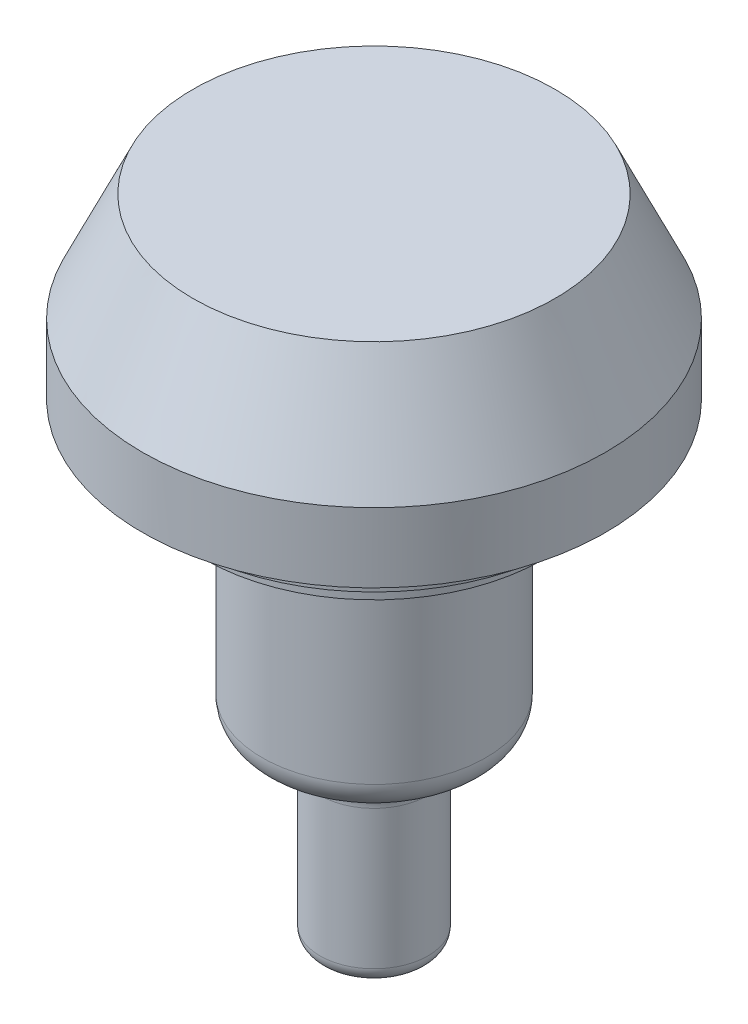
ISO-10303-21;
HEADER;
FILE_DESCRIPTION(('STEP AP214'),'2;1');
FILE_NAME('part.step','',(''),(''),'','','');
FILE_SCHEMA(('AUTOMOTIVE_DESIGN { 1 0 10303 214 1 1 1 1 }'));
ENDSEC;
DATA;
#1=APPLICATION_CONTEXT('core data for automotive mechanical design processes');
#2=APPLICATION_PROTOCOL_DEFINITION('international standard','automotive_design',2000,#1);
#3=PRODUCT_CONTEXT('',#1,'mechanical');
#4=PRODUCT('Part','Part','',(#3));
#5=PRODUCT_RELATED_PRODUCT_CATEGORY('part','',(#4));
#6=PRODUCT_DEFINITION_FORMATION('','',#4);
#7=PRODUCT_DEFINITION_CONTEXT('part definition',#1,'design');
#8=PRODUCT_DEFINITION('design','',#6,#7);
#9=PRODUCT_DEFINITION_SHAPE('','',#8);
#10=(LENGTH_UNIT() NAMED_UNIT(*) SI_UNIT(.MILLI.,.METRE.));
#11=(NAMED_UNIT(*) PLANE_ANGLE_UNIT() SI_UNIT($,.RADIAN.));
#12=(NAMED_UNIT(*) SI_UNIT($,.STERADIAN.) SOLID_ANGLE_UNIT());
#13=UNCERTAINTY_MEASURE_WITH_UNIT(LENGTH_MEASURE(1.E-05),#10,'distance_accuracy_value','');
#14=(GEOMETRIC_REPRESENTATION_CONTEXT(3) GLOBAL_UNCERTAINTY_ASSIGNED_CONTEXT((#13)) GLOBAL_UNIT_ASSIGNED_CONTEXT((#10,
#11,#12)) REPRESENTATION_CONTEXT('',''));
#15=CARTESIAN_POINT('',(0.,0.,0.));
#16=DIRECTION('',(0.,0.,1.));
#17=DIRECTION('',(1.,0.,0.));
#18=AXIS2_PLACEMENT_3D('',#15,#16,#17);
#19=CARTESIAN_POINT('',(0.,1.95,0.));
#20=DIRECTION('',(0.,1.,0.));
#21=DIRECTION('',(-0.658720422191548,0.,0.752387802524595));
#22=AXIS2_PLACEMENT_3D('',#19,#20,#21);
#23=PLANE('',#22);
#24=CARTESIAN_POINT('',(-0.0448046285500582,1.95,-0.0399100181147569));
#25=DIRECTION('',(0.,-1.,0.));
#26=DIRECTION('',(0.658720422191548,0.,-0.752387802524595));
#27=AXIS2_PLACEMENT_3D('',#24,#25,#26);
#28=CIRCLE('',#27,1.10610572348777);
#29=CARTESIAN_POINT('',(-0.668196198394019,1.95,0.873792790340968));
#30=VERTEX_POINT('',#29);
#31=CARTESIAN_POINT('',(0.791021649955044,1.94999999999869,-0.764385210023286));
#32=VERTEX_POINT('',#31);
#33=EDGE_CURVE('E58',#30,#32,#28,.T.);
#34=ORIENTED_EDGE('',*,*,#33,.F.);
#35=CARTESIAN_POINT('',(0.,1.95,0.));
#36=DIRECTION('',(0.,1.,0.));
#37=DIRECTION('',(-0.658720422191548,0.,0.752387802524595));
#38=AXIS2_PLACEMENT_3D('',#35,#36,#37);
#39=CIRCLE('',#38,1.1);
#40=EDGE_CURVE('E83',#32,#30,#39,.F.);
#41=ORIENTED_EDGE('',*,*,#40,.F.);
#42=EDGE_LOOP('',(#34,#41));
#43=FACE_BOUND('',#42,.T.);
#44=CARTESIAN_POINT('',(0.,1.95,0.));
#45=DIRECTION('',(0.,-1.,0.));
#46=DIRECTION('',(0.,0.,-1.));
#47=AXIS2_PLACEMENT_3D('',#44,#45,#46);
#48=CIRCLE('',#47,1.25);
#49=CARTESIAN_POINT('',(0.,1.95,-1.25));
#50=VERTEX_POINT('',#49);
#51=EDGE_CURVE('E206',#50,#50,#48,.T.);
#52=ORIENTED_EDGE('',*,*,#51,.T.);
#53=EDGE_LOOP('',(#52));
#54=FACE_BOUND('',#53,.T.);
#55=ADVANCED_FACE('F43',(#43,#54),#23,.F.);
#56=CARTESIAN_POINT('',(0.,0.299999999999998,0.));
#57=DIRECTION('',(0.,1.,0.));
#58=DIRECTION('',(-0.658720422191548,0.,0.752387802524595));
#59=AXIS2_PLACEMENT_3D('',#56,#57,#58);
#60=CYLINDRICAL_SURFACE('',#59,1.1);
#61=ORIENTED_EDGE('',*,*,#40,.T.);
#62=CARTESIAN_POINT('',(-0.915486598019785,1.74346292412624,-0.609823161946244));
#63=CARTESIAN_POINT('',(-0.943945164891574,1.75116457478404,-0.567140167663536));
#64=CARTESIAN_POINT('',(-0.969375914665018,1.75882984965591,-0.522451288770474));
#65=CARTESIAN_POINT('',(-1.0138521111218,1.77406122869552,-0.42981261501476));
#66=CARTESIAN_POINT('',(-1.0328777795935,1.78162695760265,-0.381853259713522));
#67=CARTESIAN_POINT('',(-1.06736490140067,1.79818369857554,-0.273206339421187));
#68=CARTESIAN_POINT('',(-1.08119528380563,1.80713370081647,-0.211989307676555));
#69=CARTESIAN_POINT('',(-1.09823022979092,1.82466013635233,-0.0881848131171558));
#70=CARTESIAN_POINT('',(-1.10146475447942,1.83323755519239,-0.025601719034775));
#71=CARTESIAN_POINT('',(-1.09861928965978,1.84466720209777,0.0597446990209417));
#72=CARTESIAN_POINT('',(-1.09712935423166,1.84771638620718,0.0827127282375821));
#73=CARTESIAN_POINT('',(-1.08894684501291,1.85888336692239,0.167457128924949));
#74=CARTESIAN_POINT('',(-1.07771594553618,1.866815003287,0.228899326109345));
#75=CARTESIAN_POINT('',(-1.04498242643328,1.8821701814969,0.349159217324231));
#76=CARTESIAN_POINT('',(-1.02345579965003,1.88959248921902,0.407970424229154));
#77=CARTESIAN_POINT('',(-0.970765350805557,1.90385186330161,0.521051658536534));
#78=CARTESIAN_POINT('',(-0.939620653446552,1.91069005697806,0.575330428591939));
#79=CARTESIAN_POINT('',(-0.86854585856241,1.92375901222159,0.677878997181826));
#80=CARTESIAN_POINT('',(-0.828615708362194,1.92998977014633,0.726148759685288));
#81=CARTESIAN_POINT('',(-0.741265408447276,1.94179925656376,0.815108293070741));
#82=CARTESIAN_POINT('',(-0.693870840635844,1.94738010275694,0.855822954772671));
#83=CARTESIAN_POINT('',(-0.592908798442302,1.95789310112659,0.928609229198853));
#84=CARTESIAN_POINT('',(-0.539356433937672,1.96282678015174,0.960701379639754));
#85=CARTESIAN_POINT('',(-0.465006269529861,1.96896462451942,0.99709483111598));
#86=CARTESIAN_POINT('',(-0.446220380440334,1.97045890290197,1.00564183887785));
#87=CARTESIAN_POINT('',(-0.389877888575809,1.97478272097837,1.02938396759045));
#88=CARTESIAN_POINT('',(-0.351653993587545,1.9775134816208,1.04306206401));
#89=CARTESIAN_POINT('',(-0.273875276211961,1.98270840327475,1.06613521191555));
#90=CARTESIAN_POINT('',(-0.234318478486845,1.98517214353565,1.07552357671605));
#91=CARTESIAN_POINT('',(-0.133438181589357,1.99105352395393,1.09362377689738));
#92=CARTESIAN_POINT('',(-0.0715521301081961,1.99429602508997,1.09941299384485));
#93=CARTESIAN_POINT('',(0.0523720008038257,2.00017197101951,1.10050340020751));
#94=CARTESIAN_POINT('',(0.114410170581359,2.00280479897993,1.0957940184658));
#95=CARTESIAN_POINT('',(0.236696069375031,2.00746667293534,1.07600810831917));
#96=CARTESIAN_POINT('',(0.296948284382647,2.00949737221633,1.06096035088571));
#97=CARTESIAN_POINT('',(0.384745960491084,2.01210461575112,1.03098590758095));
#98=CARTESIAN_POINT('',(0.413594760510347,2.01290083495343,1.01975356822588));
#99=CARTESIAN_POINT('',(0.470248375990826,2.01434881485357,0.994898091486304));
#100=CARTESIAN_POINT('',(0.498053154644858,2.01500057046227,0.981274869906644));
#101=CARTESIAN_POINT('',(0.525248448528422,2.0155812470126,0.966495766839479));
#102=B_SPLINE_CURVE_WITH_KNOTS('',3,(#62,#63,#64,#65,#66,#67,#68,#69,#70,#71,#72,#73,#74,#75,
#76,#77,#78,#79,#80,#81,#82,#83,#84,#85,#86,#87,#88,#89,#90,#91,#92,#93,#94,#95,#96,#97,#98,#99,
#100,#101),.UNSPECIFIED.,.F.,.F.,(4,2,2,2,2,2,2,2,2,2,2,2,2,2,2,2,2,2,2,4),(0.,
0.155474439203372,0.311424655405811,0.500708630247019,0.689456916956165,0.759088541513781,
0.946971053847692,1.13529381481297,1.32324449742105,1.51119630695875,1.69851745337782,
1.88538838784893,1.94745069107202,2.06923423604701,2.19120697077319,2.37698078195417,
2.56294173535168,2.7483872576961,2.84119773590927,2.93401148310828),.UNSPECIFIED.);
#103=CARTESIAN_POINT('',(-1.09476930649319,1.85093592920389,0.107145534486444));
#104=VERTEX_POINT('',#103);
#105=EDGE_CURVE('E86',#104,#30,#102,.T.);
#106=ORIENTED_EDGE('',*,*,#105,.F.);
#107=CARTESIAN_POINT('',(-0.00855734479166328,1.85326038980945,-1.09996671397364));
#108=CARTESIAN_POINT('',(-0.00993979508496553,1.85273730387153,-1.09995606833286));
#109=CARTESIAN_POINT('',(-0.0113540452003549,1.85234562789422,-1.0999423730486));
#110=CARTESIAN_POINT('',(-0.0145624367885215,1.85164557724258,-1.09990498815906));
#111=CARTESIAN_POINT('',(-0.0163663148780678,1.85137973408686,-1.09987968903415));
#112=CARTESIAN_POINT('',(-0.0251939447708239,1.85018779879858,-1.09973400287207));
#113=CARTESIAN_POINT('',(-0.032242737729209,1.84957296347319,-1.09955005586147));
#114=CARTESIAN_POINT('',(-0.0534056498261139,1.84800012250523,-1.09879341028478));
#115=CARTESIAN_POINT('',(-0.0675344333635465,1.847314017439,-1.09801590164543));
#116=CARTESIAN_POINT('',(-0.0957679306521109,1.84618485521401,-1.09591489461658));
#117=CARTESIAN_POINT('',(-0.109872609754976,1.84574202489366,-1.09459088866003));
#118=CARTESIAN_POINT('',(-0.152484322192185,1.84463287365812,-1.08975787985439));
#119=CARTESIAN_POINT('',(-0.180908209137961,1.84420398792293,-1.08540127014751));
#120=CARTESIAN_POINT('',(-0.237334749715462,1.84366371633864,-1.07447669619985));
#121=CARTESIAN_POINT('',(-0.265337155868344,1.84355251030033,-1.06790748194694));
#122=CARTESIAN_POINT('',(-0.348530233403254,1.84354897243334,-1.04490812244565));
#123=CARTESIAN_POINT('',(-0.402854448401092,1.84398752094971,-1.02519222175516));
#124=CARTESIAN_POINT('',(-0.507689406712555,1.84531102629111,-0.977533391764518));
#125=CARTESIAN_POINT('',(-0.558201862268665,1.84619578129132,-0.949594184346997));
#126=CARTESIAN_POINT('',(-0.654176746409287,1.8481596491768,-0.886199414300844));
#127=CARTESIAN_POINT('',(-0.699647647423077,1.84923842774673,-0.850756762282249));
#128=CARTESIAN_POINT('',(-0.764556060909855,1.8504608660493,-0.791445699205076));
#129=CARTESIAN_POINT('',(-0.786199335966216,1.85080579771861,-0.769947671638242));
#130=CARTESIAN_POINT('',(-0.827630329540598,1.85100401360584,-0.72522917768518));
#131=CARTESIAN_POINT('',(-0.847417955360651,1.85085727327597,-0.702008625354812));
#132=CARTESIAN_POINT('',(-0.904231192984285,1.8499729050725,-0.629415916513786));
#133=CARTESIAN_POINT('',(-0.938186324321254,1.84878440957154,-0.577588541414445));
#134=CARTESIAN_POINT('',(-0.996982921935284,1.84660423170925,-0.468891291353984));
#135=CARTESIAN_POINT('',(-1.0218039187706,1.84561299365221,-0.412010441236026));
#136=CARTESIAN_POINT('',(-1.0615771830029,1.84409744918066,-0.294759088914627));
#137=CARTESIAN_POINT('',(-1.07651616810467,1.84357377087859,-0.23438400813478));
#138=CARTESIAN_POINT('',(-1.09113961257739,1.84354149508796,-0.142737095153309));
#139=CARTESIAN_POINT('',(-1.09471685318566,1.84365584721402,-0.112034816521109));
#140=CARTESIAN_POINT('',(-1.09927496947723,1.84425290799365,-0.0504456015723031));
#141=CARTESIAN_POINT('',(-1.10025768146964,1.84473535581114,-0.0195588113723566));
#142=CARTESIAN_POINT('',(-1.09972962709913,1.84618950673447,0.0320532191002703));
#143=CARTESIAN_POINT('',(-1.09892887881413,1.84694975261948,0.0528000505056662));
#144=CARTESIAN_POINT('',(-1.0969872568779,1.84858933481597,0.0817732800400518));
#145=CARTESIAN_POINT('',(-1.09634009046476,1.8491224479868,0.0900301026022301));
#146=CARTESIAN_POINT('',(-1.09523771973328,1.85035797946265,0.10233120117168));
#147=CARTESIAN_POINT('',(-1.09484829964873,1.85084250752662,0.106417778666949));
#148=CARTESIAN_POINT('',(-1.0942349221656,1.85169370325126,0.112488167966511));
#149=CARTESIAN_POINT('',(-1.09403028530595,1.85199054210852,0.114459852039297));
#150=CARTESIAN_POINT('',(-1.09374510935851,1.85285419454195,0.11714262904443));
#151=CARTESIAN_POINT('',(-1.09366034181904,1.85317056392993,0.117931471060739));
#152=CARTESIAN_POINT('',(-1.09357740288601,1.85356641745139,0.118694835174588));
#153=B_SPLINE_CURVE_WITH_KNOTS('',3,(#107,#108,#109,#110,#111,#112,#113,#114,#115,#116,#117,
#118,#119,#120,#121,#122,#123,#124,#125,#126,#127,#128,#129,#130,#131,#132,#133,#134,#135,#136,
#137,#138,#139,#140,#141,#142,#143,#144,#145,#146,#147,#148,#149,#150,#151,#152),.UNSPECIFIED.,
.F.,.F.,(4,2,2,2,2,2,2,2,2,2,2,2,2,2,2,2,2,2,2,2,2,2,4),(0.,0.0044037435222713,
0.00986403922279407,0.0310985293297633,0.0735731511065102,0.116087310868016,0.20225694607549,
0.288475344748968,0.461068393494168,0.633583446139653,0.805804043216727,0.897231717061119,
0.988663955695987,1.17361806302945,1.35898416114147,1.54459890410945,1.63724387105953,
1.72982324981094,1.79214262318768,1.81700514393278,1.82943784209397,1.83540232340249,
1.83796591659925),.UNSPECIFIED.);
#154=CARTESIAN_POINT('',(-1.08111693483492,1.84360323981823,-0.20294376859939));
#155=VERTEX_POINT('',#154);
#156=EDGE_CURVE('E139',#104,#155,#153,.F.);
#157=ORIENTED_EDGE('',*,*,#156,.T.);
#158=CARTESIAN_POINT('',(-1.09946423159981,1.83519987667276,0.034327881271435));
#159=CARTESIAN_POINT('',(-1.09946535213747,1.83525167349134,0.0342920006333994));
#160=CARTESIAN_POINT('',(-1.09946665964423,1.83529785662923,0.0342500594010405));
#161=CARTESIAN_POINT('',(-1.09946948311624,1.83538149642558,0.034159297171583));
#162=CARTESIAN_POINT('',(-1.0994709953555,1.83541908250055,0.0341105988250543));
#163=CARTESIAN_POINT('',(-1.09947720947697,1.83555965537534,0.0339100031889066));
#164=CARTESIAN_POINT('',(-1.09948226343554,1.8356437458204,0.0337458047611557));
#165=CARTESIAN_POINT('',(-1.09949261807048,1.83579513673816,0.0334067869253979));
#166=CARTESIAN_POINT('',(-1.09949792171633,1.83586203649006,0.0332318149163343));
#167=CARTESIAN_POINT('',(-1.09954469961122,1.83641897231248,0.0316755699598856));
#168=CARTESIAN_POINT('',(-1.09958568975936,1.83667660541692,0.0302214317486111));
#169=CARTESIAN_POINT('',(-1.09977554219023,1.83783276058341,0.0229723202596975));
#170=CARTESIAN_POINT('',(-1.09988161540259,1.83835167877652,0.0171625698245873));
#171=CARTESIAN_POINT('',(-1.10006120136848,1.83967949699788,-0.000285181617655561));
#172=CARTESIAN_POINT('',(-1.09999666623088,1.84026124976626,-0.0119555269271108));
#173=CARTESIAN_POINT('',(-1.0994958016181,1.84121538702103,-0.0352978895549427));
#174=CARTESIAN_POINT('',(-1.09905900399453,1.84158750689894,-0.0469698904678813));
#175=CARTESIAN_POINT('',(-1.09718067590617,1.84252630344721,-0.0821471251034872));
#176=CARTESIAN_POINT('',(-1.0951692902054,1.84290684415608,-0.105633144110443));
#177=CARTESIAN_POINT('',(-1.08964242049431,1.84341921854424,-0.152432331286369));
#178=CARTESIAN_POINT('',(-1.08612628161255,1.84355094380329,-0.17574541969637));
#179=CARTESIAN_POINT('',(-1.07331893894628,1.8436875084682,-0.245389064254365));
#180=CARTESIAN_POINT('',(-1.0617741494315,1.84343209564235,-0.291324469426868));
#181=CARTESIAN_POINT('',(-1.02840523081856,1.84242406338926,-0.395234572996236));
#182=CARTESIAN_POINT('',(-1.00450787616008,1.84154227855882,-0.452547515256974));
#183=CARTESIAN_POINT('',(-0.947466605835286,1.83934425416549,-0.562240966777854));
#184=CARTESIAN_POINT('',(-0.914342892819457,1.83802896269735,-0.614631922100573));
#185=CARTESIAN_POINT('',(-0.865006040474519,1.83649026829555,-0.679831461935059));
#186=CARTESIAN_POINT('',(-0.852458731430448,1.83612883698407,-0.695500423136863));
#187=CARTESIAN_POINT('',(-0.833544079081294,1.83546249635864,-0.717834985301457));
#188=CARTESIAN_POINT('',(-0.827507910486508,1.83523289118395,-0.724783056365537));
#189=CARTESIAN_POINT('',(-0.821384912694009,1.83497243609263,-0.731654023383165));
#190=B_SPLINE_CURVE_WITH_KNOTS('',3,(#158,#159,#160,#161,#162,#163,#164,#165,#166,#167,#168,
#169,#170,#171,#172,#173,#174,#175,#176,#177,#178,#179,#180,#181,#182,#183,#184,#185,#186,#187,
#188,#189),.UNSPECIFIED.,.F.,.F.,(4,2,2,2,2,2,2,2,2,2,2,2,2,2,2,4),(0.,0.000186882671486975,
0.000370733504283599,0.00092088199138399,0.00148288200293672,0.005885201384305,
0.023414144423681,0.0584300260380131,0.0934900078752685,0.164151113994454,0.234843003283637,
0.376523576381709,0.561948231639137,0.74697001798191,0.807178817657127,0.834796941961388),.UNSPECIFIED.);
#191=CARTESIAN_POINT('',(-0.832501993411637,1.83539987667722,-0.718977659362765));
#192=VERTEX_POINT('',#191);
#193=EDGE_CURVE('E92',#155,#192,#190,.T.);
#194=ORIENTED_EDGE('',*,*,#193,.T.);
#195=CARTESIAN_POINT('',(-0.0448046285500582,1.83539987667722,-0.0399100181147569));
#196=DIRECTION('',(0.,-1.,0.));
#197=DIRECTION('',(0.658720422191548,0.,-0.752387802524595));
#198=AXIS2_PLACEMENT_3D('',#195,#196,#197);
#199=CIRCLE('',#198,1.04);
#200=CARTESIAN_POINT('',(-0.810068306501531,1.83539987667722,-0.744162460927834));
#201=VERTEX_POINT('',#200);
#202=EDGE_CURVE('E66',#192,#201,#199,.T.);
#203=ORIENTED_EDGE('',*,*,#202,.T.);
#204=CARTESIAN_POINT('',(-0.0924672873792373,1.83507970086425,-1.09610665574322));
#205=CARTESIAN_POINT('',(-0.0924741215590893,1.83510131298383,-1.09610607920941));
#206=CARTESIAN_POINT('',(-0.0924828089664599,1.83512220475948,-1.09610534628014));
#207=CARTESIAN_POINT('',(-0.0925029179697273,1.83516224192602,-1.09610364942036));
#208=CARTESIAN_POINT('',(-0.0925142962231102,1.83518140895185,-1.09610268915146));
#209=CARTESIAN_POINT('',(-0.0925607643868696,1.83525068585013,-1.0960987665447));
#210=CARTESIAN_POINT('',(-0.0926024837747965,1.83529620178722,-1.09609524309822));
#211=CARTESIAN_POINT('',(-0.09269329438018,1.83538016335595,-1.09608756739072));
#212=CARTESIAN_POINT('',(-0.0927425126943106,1.83541845502383,-1.09608340427519));
#213=CARTESIAN_POINT('',(-0.0929446895004997,1.83556087106399,-1.09606628778446));
#214=CARTESIAN_POINT('',(-0.0931106530971017,1.83564574822135,-1.09605220392037));
#215=CARTESIAN_POINT('',(-0.0934490100209512,1.83579667744507,-1.09602340885031));
#216=CARTESIAN_POINT('',(-0.093621391450152,1.83586276255926,-1.0960086987986));
#217=CARTESIAN_POINT('',(-0.0951702375666012,1.83641892994009,-1.09587613891706));
#218=CARTESIAN_POINT('',(-0.0966196406000967,1.83667658792911,-1.09574936355939));
#219=CARTESIAN_POINT('',(-0.103843155566011,1.83783283042649,-1.09510300164826));
#220=CARTESIAN_POINT('',(-0.109626060149873,1.83835170182011,-1.09453928950053));
#221=CARTESIAN_POINT('',(-0.126981186031906,1.83967971468026,-1.0927079008057));
#222=CARTESIAN_POINT('',(-0.138570206720884,1.84026159967235,-1.09129921099709));
#223=CARTESIAN_POINT('',(-0.161699770729566,1.84121561197193,-1.08811308166198));
#224=CARTESIAN_POINT('',(-0.173240276772771,1.84158759981639,-1.0863353980333));
#225=CARTESIAN_POINT('',(-0.207972936558945,1.84252655681677,-1.08041717477604));
#226=CARTESIAN_POINT('',(-0.231080376651477,1.84290716355818,-1.0757120606697));
#227=CARTESIAN_POINT('',(-0.276949993566797,1.84341952854652,-1.06482645656154));
#228=CARTESIAN_POINT('',(-0.299712014593257,1.8435511776307,-1.05864532069228));
#229=CARTESIAN_POINT('',(-0.367407014744984,1.84368729108688,-1.03790154406733));
#230=CARTESIAN_POINT('',(-0.411688683561709,1.8434319159251,-1.02114881930225));
#231=CARTESIAN_POINT('',(-0.511041822894386,1.84242411751573,-0.976044704568256));
#232=CARTESIAN_POINT('',(-0.565216538895774,1.84154243373755,-0.945708688248984));
#233=CARTESIAN_POINT('',(-0.667611609208022,1.83934447042717,-0.876415016163894));
#234=CARTESIAN_POINT('',(-0.715843639950439,1.83802906242258,-0.837474701261497));
#235=CARTESIAN_POINT('',(-0.774931081249809,1.83649026873366,-0.780953319091207));
#236=CARTESIAN_POINT('',(-0.789050688683879,1.83612883705934,-0.76668490144894));
#237=CARTESIAN_POINT('',(-0.809058210881307,1.83546249626623,-0.745323828390406));
#238=CARTESIAN_POINT('',(-0.81526485722192,1.83523289104854,-0.738527611597971));
#239=CARTESIAN_POINT('',(-0.821384912694009,1.83497243609263,-0.731654023383172));
#240=B_SPLINE_CURVE_WITH_KNOTS('',3,(#204,#205,#206,#207,#208,#209,#210,#211,#212,#213,#214,
#215,#216,#217,#218,#219,#220,#221,#222,#223,#224,#225,#226,#227,#228,#229,#230,#231,#232,#233,
#234,#235,#236,#237,#238,#239),.UNSPECIFIED.,.F.,.F.,(4,2,2,2,2,2,2,2,2,2,2,2,2,2,2,2,2,4),(0.,
6.77562135846907E-05,0.000134487602406872,0.000318081770058338,0.000505230795423202,
0.001061791711697,0.00161736771533274,0.00601968728613713,0.023548631082849,0.0585749412675526,
0.0936244968408819,0.164314174931119,0.235034841787796,0.376658167509954,0.562066544951151,
0.747104609499654,0.807313392541829,0.834931516846083),.UNSPECIFIED.);
#241=CARTESIAN_POINT('',(-0.326106386345146,1.84360323981823,-1.05054967744736));
#242=VERTEX_POINT('',#241);
#243=EDGE_CURVE('E140',#201,#242,#240,.F.);
#244=ORIENTED_EDGE('',*,*,#243,.T.);
#245=CARTESIAN_POINT('',(-0.0196528622328461,1.85093592920389,-1.09982442462606));
#246=VERTEX_POINT('',#245);
#247=EDGE_CURVE('E102',#242,#246,#153,.F.);
#248=ORIENTED_EDGE('',*,*,#247,.T.);
#249=CARTESIAN_POINT('',(0.887517914541648,2.018861271022,0.649855331106681));
#250=CARTESIAN_POINT('',(0.905782645657606,2.01870128478545,0.624910561397183));
#251=CARTESIAN_POINT('',(0.922986404361818,2.01847123073252,0.599207762234235));
#252=CARTESIAN_POINT('',(0.955169822121519,2.01786978233226,0.546448900480671));
#253=CARTESIAN_POINT('',(0.970149591995517,2.01749839503068,0.519392905407945));
#254=CARTESIAN_POINT('',(1.01154822747358,2.0161721238376,0.436543615693591));
#255=CARTESIAN_POINT('',(1.03449864122427,2.01500451324954,0.378970165425753));
#256=CARTESIAN_POINT('',(1.07042712528455,2.01209342763903,0.2607856703988));
#257=CARTESIAN_POINT('',(1.08339687474159,2.01034947384834,0.20017213587093));
#258=CARTESIAN_POINT('',(1.09899460497374,2.00627326286763,0.0776181223949942));
#259=CARTESIAN_POINT('',(1.10161923950121,2.00394081558207,0.0156772206073407));
#260=CARTESIAN_POINT('',(1.09645166627158,1.99867374294069,-0.107787494079663));
#261=CARTESIAN_POINT('',(1.08864997320322,1.99573857131564,-0.169310875941093));
#262=CARTESIAN_POINT('',(1.06285310553332,1.98925755784434,-0.290074076814318));
#263=CARTESIAN_POINT('',(1.04487589046075,1.98571279955586,-0.349317723277346));
#264=CARTESIAN_POINT('',(1.01291084935795,1.98030576636892,-0.429690429582741));
#265=CARTESIAN_POINT('',(1.00292921057439,1.9786996046343,-0.452495091216148));
#266=CARTESIAN_POINT('',(0.981448833143792,1.97538577973139,-0.497370046374264));
#267=CARTESIAN_POINT('',(0.969950131107756,1.9736781190131,-0.519440357604825));
#268=CARTESIAN_POINT('',(0.927284335949208,1.96754441401712,-0.594947583839971));
#269=CARTESIAN_POINT('',(0.892279526137913,1.9628493966382,-0.646264124112937));
#270=CARTESIAN_POINT('',(0.814138278669284,1.9528211064236,-0.742310075813996));
#271=CARTESIAN_POINT('',(0.770987222273598,1.94748669254946,-0.787027383584226));
#272=CARTESIAN_POINT('',(0.677844596680784,1.93619414740144,-0.868534866103928));
#273=CARTESIAN_POINT('',(0.627855618227355,1.93023625255121,-0.905328029615976));
#274=CARTESIAN_POINT('',(0.522460283949613,1.91771398669406,-0.969978165448588));
#275=CARTESIAN_POINT('',(0.467053240966877,1.91114953876549,-0.997834002349333));
#276=CARTESIAN_POINT('',(0.352149492611319,1.89741465200558,-1.04395614257246));
#277=CARTESIAN_POINT('',(0.292634376673924,1.89024144699929,-1.06217561702305));
#278=CARTESIAN_POINT('',(0.171540817586425,1.87537034078282,-1.08829908361139));
#279=CARTESIAN_POINT('',(0.109967180458413,1.8676736235142,-1.09622558761921));
#280=CARTESIAN_POINT('',(0.0251343017426516,1.85677776933171,-1.09995842552974));
#281=CARTESIAN_POINT('',(0.00197341781496127,1.85377320101785,-1.10024315423957));
#282=CARTESIAN_POINT('',(-0.0718151709688892,1.84409264626375,-1.09881833993618));
#283=CARTESIAN_POINT('',(-0.122406051456575,1.83729290731528,-1.09433974590586));
#284=CARTESIAN_POINT('',(-0.233893897983949,1.82184611232567,-1.07664752852545));
#285=CARTESIAN_POINT('',(-0.294502058679607,1.81313219849453,-1.0616705982218));
#286=CARTESIAN_POINT('',(-0.412314413547727,1.79538793420025,-1.02169458214356));
#287=CARTESIAN_POINT('',(-0.469518652998936,1.78635758794879,-0.996695629715526));
#288=CARTESIAN_POINT('',(-0.538742953935463,1.77478819271565,-0.959184270576454));
#289=CARTESIAN_POINT('',(-0.553181059268073,1.77233712742139,-0.95093010855647));
#290=CARTESIAN_POINT('',(-0.58163618814928,1.76742664114378,-0.933795287953962));
#291=CARTESIAN_POINT('',(-0.595654046170676,1.76496724923916,-0.92491600691434));
#292=CARTESIAN_POINT('',(-0.609469073004068,1.76250107520464,-0.915722364612598));
#293=B_SPLINE_CURVE_WITH_KNOTS('',3,(#249,#250,#251,#252,#253,#254,#255,#256,#257,#258,#259,
#260,#261,#262,#263,#264,#265,#266,#267,#268,#269,#270,#271,#272,#273,#274,#275,#276,#277,#278,
#279,#280,#281,#282,#283,#284,#285,#286,#287,#288,#289,#290,#291,#292),.UNSPECIFIED.,.F.,.F.,(4,
2,2,2,2,2,2,2,2,2,2,2,2,2,2,2,2,2,2,2,2,4),(0.,0.0926942964220885,0.185383972455029,
0.37040072472384,0.555571558344375,0.740802282709874,0.926201634775556,1.11127477767124,
1.18606482546791,1.26085306870028,1.44676697138997,1.63301773059753,1.81919811779472,
2.0054021484463,2.19250293003711,2.379193808353,2.44923838484213,2.60244362042367,
2.79068351937482,2.97892091381067,3.02934232814188,3.07965591382405),.UNSPECIFIED.);
#294=EDGE_CURVE('E89',#32,#246,#293,.T.);
#295=ORIENTED_EDGE('',*,*,#294,.F.);
#296=EDGE_LOOP('',(#61,#106,#157,#194,#203,#244,#248,#295));
#297=FACE_BOUND('',#296,.T.);
#298=CARTESIAN_POINT('',(0.,1.8,0.));
#299=DIRECTION('',(0.,-1.,0.));
#300=DIRECTION('',(0.,0.,-1.));
#301=AXIS2_PLACEMENT_3D('',#298,#299,#300);
#302=CIRCLE('',#301,1.10000000000004);
#303=CARTESIAN_POINT('',(0.,1.8,-1.10000000000004));
#304=VERTEX_POINT('',#303);
#305=EDGE_CURVE('E96',#304,#304,#302,.T.);
#306=ORIENTED_EDGE('',*,*,#305,.F.);
#307=EDGE_LOOP('',(#306));
#308=FACE_BOUND('',#307,.T.);
#309=ADVANCED_FACE('F84',(#297,#308),#60,.T.);
#310=CARTESIAN_POINT('',(-0.0448046285500582,1.83497243609263,-0.0399100181147569));
#311=DIRECTION('',(0.,-1.,0.));
#312=DIRECTION('',(0.658720422191548,0.,-0.752387802524595));
#313=AXIS2_PLACEMENT_3D('',#310,#311,#312);
#314=TOROIDAL_SURFACE('',#313,1.04863080372558,0.00864138174152732);
#315=ORIENTED_EDGE('',*,*,#193,.F.);
#316=CARTESIAN_POINT('',(-0.0448046285500582,1.84360323981823,-0.0399100181147569));
#317=DIRECTION('',(0.,-1.,0.));
#318=DIRECTION('',(0.658720422191548,0.,-0.752387802524595));
#319=AXIS2_PLACEMENT_3D('',#316,#317,#318);
#320=CIRCLE('',#319,1.04905824430988);
#321=EDGE_CURVE('E104',#155,#242,#320,.T.);
#322=ORIENTED_EDGE('',*,*,#321,.T.);
#323=ORIENTED_EDGE('',*,*,#243,.F.);
#324=ORIENTED_EDGE('',*,*,#202,.F.);
#325=EDGE_LOOP('',(#315,#322,#323,#324));
#326=FACE_BOUND('',#325,.T.);
#327=ADVANCED_FACE('F131',(#326),#314,.F.);
#328=CARTESIAN_POINT('',(-0.0448046285500582,1.85415932144246,-0.0399100181147569));
#329=DIRECTION('',(0.,-1.,0.));
#330=DIRECTION('',(0.658720422191548,0.,-0.752387802524595));
#331=AXIS2_PLACEMENT_3D('',#328,#329,#330);
#332=TOROIDAL_SURFACE('',#331,1.0501063950942,0.0106079912954259);
#333=ORIENTED_EDGE('',*,*,#156,.F.);
#334=CARTESIAN_POINT('',(-0.0448046285500582,1.85093592920389,-0.0399100181147569));
#335=DIRECTION('',(0.,-1.,0.));
#336=DIRECTION('',(0.658720422191548,0.,-0.752387802524595));
#337=AXIS2_PLACEMENT_3D('',#334,#335,#336);
#338=CIRCLE('',#337,1.0602127901884);
#339=EDGE_CURVE('E95',#104,#246,#338,.T.);
#340=ORIENTED_EDGE('',*,*,#339,.T.);
#341=ORIENTED_EDGE('',*,*,#247,.F.);
#342=ORIENTED_EDGE('',*,*,#321,.F.);
#343=EDGE_LOOP('',(#333,#340,#341,#342));
#344=FACE_BOUND('',#343,.T.);
#345=ADVANCED_FACE('F126',(#344),#332,.T.);
#346=CARTESIAN_POINT('',(-0.0448046285500582,1.72034423469864,-0.0399100181147569));
#347=DIRECTION('',(0.,-1.,0.));
#348=DIRECTION('',(0.658720422191548,0.,-0.752387802524595));
#349=AXIS2_PLACEMENT_3D('',#346,#347,#348);
#350=TOROIDAL_SURFACE('',#349,1.47197271129301,0.43197271129301);
#351=ORIENTED_EDGE('',*,*,#33,.T.);
#352=ORIENTED_EDGE('',*,*,#294,.T.);
#353=ORIENTED_EDGE('',*,*,#339,.F.);
#354=ORIENTED_EDGE('',*,*,#105,.T.);
#355=EDGE_LOOP('',(#351,#352,#353,#354));
#356=FACE_BOUND('',#355,.T.);
#357=ADVANCED_FACE('F98',(#356),#350,.F.);
#358=CARTESIAN_POINT('',(0.,1.8,0.));
#359=DIRECTION('',(0.,-1.,0.));
#360=DIRECTION('',(0.,0.,-1.));
#361=AXIS2_PLACEMENT_3D('',#358,#359,#360);
#362=CYLINDRICAL_SURFACE('',#361,0.725);
#363=CARTESIAN_POINT('',(0.,0.499217985566781,0.));
#364=DIRECTION('',(0.,-1.,0.));
#365=DIRECTION('',(0.,0.,-1.));
#366=AXIS2_PLACEMENT_3D('',#363,#364,#365);
#367=CIRCLE('',#366,0.725);
#368=CARTESIAN_POINT('',(0.,0.499217985566781,-0.725));
#369=VERTEX_POINT('',#368);
#370=EDGE_CURVE('E159',#369,#369,#367,.F.);
#371=ORIENTED_EDGE('',*,*,#370,.T.);
#372=EDGE_LOOP('',(#371));
#373=FACE_BOUND('',#372,.T.);
#374=CARTESIAN_POINT('',(0.,1.8,0.));
#375=DIRECTION('',(0.,-1.,0.));
#376=DIRECTION('',(0.,0.,-1.));
#377=AXIS2_PLACEMENT_3D('',#374,#375,#376);
#378=CIRCLE('',#377,0.725);
#379=CARTESIAN_POINT('',(0.,1.8,-0.725));
#380=VERTEX_POINT('',#379);
#381=EDGE_CURVE('E199',#380,#380,#378,.T.);
#382=ORIENTED_EDGE('',*,*,#381,.T.);
#383=EDGE_LOOP('',(#382));
#384=FACE_BOUND('',#383,.T.);
#385=ADVANCED_FACE('F125',(#373,#384),#362,.T.);
#386=CARTESIAN_POINT('',(0.,1.8,0.));
#387=DIRECTION('',(0.,-1.,0.));
#388=DIRECTION('',(0.,0.,-1.));
#389=AXIS2_PLACEMENT_3D('',#386,#387,#388);
#390=PLANE('',#389);
#391=ORIENTED_EDGE('',*,*,#381,.F.);
#392=EDGE_LOOP('',(#391));
#393=FACE_BOUND('',#392,.T.);
#394=ORIENTED_EDGE('',*,*,#305,.T.);
#395=EDGE_LOOP('',(#394));
#396=FACE_BOUND('',#395,.T.);
#397=ADVANCED_FACE('F217',(#393,#396),#390,.T.);
#398=CARTESIAN_POINT('',(0.,2.15,0.));
#399=DIRECTION('',(0.,-1.,0.));
#400=DIRECTION('',(0.,0.,-1.));
#401=AXIS2_PLACEMENT_3D('',#398,#399,#400);
#402=PLANE('',#401);
#403=CARTESIAN_POINT('',(0.,2.15,0.));
#404=DIRECTION('',(0.,-1.,0.));
#405=DIRECTION('',(0.,0.,-1.));
#406=AXIS2_PLACEMENT_3D('',#403,#404,#405);
#407=CIRCLE('',#406,1.25);
#408=CARTESIAN_POINT('',(0.,2.15,-1.25));
#409=VERTEX_POINT('',#408);
#410=EDGE_CURVE('E205',#409,#409,#407,.T.);
#411=ORIENTED_EDGE('',*,*,#410,.F.);
#412=EDGE_LOOP('',(#411));
#413=FACE_BOUND('',#412,.T.);
#414=CARTESIAN_POINT('',(0.,2.15,0.));
#415=DIRECTION('',(0.,-1.,0.));
#416=DIRECTION('',(0.,0.,-1.));
#417=AXIS2_PLACEMENT_3D('',#414,#415,#416);
#418=CIRCLE('',#417,1.50000000044018);
#419=CARTESIAN_POINT('',(0.,2.15,-1.50000000044018));
#420=VERTEX_POINT('',#419);
#421=EDGE_CURVE('E202',#420,#420,#418,.T.);
#422=ORIENTED_EDGE('',*,*,#421,.T.);
#423=EDGE_LOOP('',(#422));
#424=FACE_BOUND('',#423,.T.);
#425=ADVANCED_FACE('F215',(#413,#424),#402,.T.);
#426=CARTESIAN_POINT('',(0.,2.15,0.));
#427=DIRECTION('',(0.,-1.,0.));
#428=DIRECTION('',(0.,0.,-1.));
#429=AXIS2_PLACEMENT_3D('',#426,#427,#428);
#430=CYLINDRICAL_SURFACE('',#429,1.25);
#431=ORIENTED_EDGE('',*,*,#410,.T.);
#432=EDGE_LOOP('',(#431));
#433=FACE_BOUND('',#432,.T.);
#434=ORIENTED_EDGE('',*,*,#51,.F.);
#435=EDGE_LOOP('',(#434));
#436=FACE_BOUND('',#435,.T.);
#437=ADVANCED_FACE('F212',(#433,#436),#430,.T.);
#438=CARTESIAN_POINT('',(0.,3.3,0.));
#439=DIRECTION('',(0.,1.,0.));
#440=DIRECTION('',(0.,0.,1.));
#441=AXIS2_PLACEMENT_3D('',#438,#439,#440);
#442=PLANE('',#441);
#443=CARTESIAN_POINT('',(0.,3.3,0.));
#444=DIRECTION('',(0.,1.,0.));
#445=DIRECTION('',(0.,0.,1.));
#446=AXIS2_PLACEMENT_3D('',#443,#444,#445);
#447=CIRCLE('',#446,1.1735846392915);
#448=CARTESIAN_POINT('',(0.,3.3,1.1735846392915));
#449=VERTEX_POINT('',#448);
#450=EDGE_CURVE('E91',#449,#449,#447,.T.);
#451=ORIENTED_EDGE('',*,*,#450,.T.);
#452=EDGE_LOOP('',(#451));
#453=FACE_BOUND('',#452,.T.);
#454=ADVANCED_FACE('F224',(#453),#442,.T.);
#455=CARTESIAN_POINT('',(0.,5.,0.));
#456=DIRECTION('',(0.,-1.,0.));
#457=DIRECTION('',(0.,0.,-1.));
#458=AXIS2_PLACEMENT_3D('',#455,#456,#457);
#459=CYLINDRICAL_SURFACE('',#458,1.5);
#460=CARTESIAN_POINT('',(0.,2.6,0.));
#461=DIRECTION('',(0.,1.,0.));
#462=DIRECTION('',(0.,0.,1.));
#463=AXIS2_PLACEMENT_3D('',#460,#461,#462);
#464=CIRCLE('',#463,1.5);
#465=CARTESIAN_POINT('',(0.,2.6,1.5));
#466=VERTEX_POINT('',#465);
#467=EDGE_CURVE('E153',#466,#466,#464,.F.);
#468=ORIENTED_EDGE('',*,*,#467,.T.);
#469=EDGE_LOOP('',(#468));
#470=FACE_BOUND('',#469,.T.);
#471=ORIENTED_EDGE('',*,*,#421,.F.);
#472=EDGE_LOOP('',(#471));
#473=FACE_BOUND('',#472,.T.);
#474=ADVANCED_FACE('F221',(#470,#473),#459,.T.);
#475=CARTESIAN_POINT('',(0.,3.3,0.));
#476=DIRECTION('',(0.,-1.,0.));
#477=DIRECTION('',(0.,0.,-1.));
#478=AXIS2_PLACEMENT_3D('',#475,#476,#477);
#479=CONICAL_SURFACE('',#478,1.1735846392915,0.43633231299858);
#480=ORIENTED_EDGE('',*,*,#467,.F.);
#481=EDGE_LOOP('',(#480));
#482=FACE_BOUND('',#481,.T.);
#483=ORIENTED_EDGE('',*,*,#450,.F.);
#484=EDGE_LOOP('',(#483));
#485=FACE_BOUND('',#484,.T.);
#486=ADVANCED_FACE('F223',(#482,#485),#479,.T.);
#487=CARTESIAN_POINT('',(0.,-0.9,0.));
#488=DIRECTION('',(0.,-1.,0.));
#489=DIRECTION('',(0.,0.,-1.));
#490=AXIS2_PLACEMENT_3D('',#487,#488,#489);
#491=PLANE('',#490);
#492=CARTESIAN_POINT('',(0.,-0.9,0.));
#493=DIRECTION('',(0.,-1.,0.));
#494=DIRECTION('',(0.,0.,-1.));
#495=AXIS2_PLACEMENT_3D('',#492,#493,#494);
#496=CIRCLE('',#495,0.25);
#497=CARTESIAN_POINT('',(0.,-0.9,-0.25));
#498=VERTEX_POINT('',#497);
#499=EDGE_CURVE('E51',#498,#498,#496,.T.);
#500=ORIENTED_EDGE('',*,*,#499,.T.);
#501=EDGE_LOOP('',(#500));
#502=FACE_BOUND('',#501,.T.);
#503=ADVANCED_FACE('F167',(#502),#491,.T.);
#504=CARTESIAN_POINT('',(0.,-0.9,0.));
#505=DIRECTION('',(0.,1.,0.));
#506=DIRECTION('',(0.,0.,1.));
#507=AXIS2_PLACEMENT_3D('',#504,#505,#506);
#508=CYLINDRICAL_SURFACE('',#507,0.35);
#509=CARTESIAN_POINT('',(0.,-0.8,0.));
#510=DIRECTION('',(0.,-1.,0.));
#511=DIRECTION('',(0.,0.,-1.));
#512=AXIS2_PLACEMENT_3D('',#509,#510,#511);
#513=CIRCLE('',#512,0.35);
#514=CARTESIAN_POINT('',(0.,-0.8,-0.35));
#515=VERTEX_POINT('',#514);
#516=EDGE_CURVE('E11',#515,#515,#513,.F.);
#517=ORIENTED_EDGE('',*,*,#516,.T.);
#518=EDGE_LOOP('',(#517));
#519=FACE_BOUND('',#518,.T.);
#520=CARTESIAN_POINT('',(0.,0.0999999999999981,0.));
#521=DIRECTION('',(0.,1.,0.));
#522=DIRECTION('',(0.,0.,1.));
#523=AXIS2_PLACEMENT_3D('',#520,#521,#522);
#524=CIRCLE('',#523,0.35);
#525=CARTESIAN_POINT('',(0.,0.0999999999999981,0.35));
#526=VERTEX_POINT('',#525);
#527=EDGE_CURVE('E156',#526,#526,#524,.F.);
#528=ORIENTED_EDGE('',*,*,#527,.T.);
#529=EDGE_LOOP('',(#528));
#530=FACE_BOUND('',#529,.T.);
#531=ADVANCED_FACE('F238',(#519,#530),#508,.T.);
#532=CARTESIAN_POINT('',(0.,0.0999999999999981,0.));
#533=DIRECTION('',(0.,1.,0.));
#534=DIRECTION('',(0.,0.,1.));
#535=AXIS2_PLACEMENT_3D('',#532,#533,#534);
#536=TOROIDAL_SURFACE('',#535,0.55,0.2);
#537=CARTESIAN_POINT('',(0.,0.29960899278337,0.));
#538=DIRECTION('',(0.,-1.,0.));
#539=DIRECTION('',(0.,0.,-1.));
#540=AXIS2_PLACEMENT_3D('',#537,#538,#539);
#541=CIRCLE('',#540,0.537500000000001);
#542=CARTESIAN_POINT('',(0.,0.29960899278337,-0.537500000000001));
#543=VERTEX_POINT('',#542);
#544=EDGE_CURVE('E162',#543,#543,#541,.T.);
#545=ORIENTED_EDGE('',*,*,#544,.T.);
#546=EDGE_LOOP('',(#545));
#547=FACE_BOUND('',#546,.T.);
#548=ORIENTED_EDGE('',*,*,#527,.F.);
#549=EDGE_LOOP('',(#548));
#550=FACE_BOUND('',#549,.T.);
#551=ADVANCED_FACE('F176',(#547,#550),#536,.F.);
#552=CARTESIAN_POINT('',(0.,0.499217985566781,0.));
#553=DIRECTION('',(0.,-1.,0.));
#554=DIRECTION('',(0.,0.,-1.));
#555=AXIS2_PLACEMENT_3D('',#552,#553,#554);
#556=TOROIDAL_SURFACE('',#555,0.525,0.2);
#557=ORIENTED_EDGE('',*,*,#544,.F.);
#558=EDGE_LOOP('',(#557));
#559=FACE_BOUND('',#558,.T.);
#560=ORIENTED_EDGE('',*,*,#370,.F.);
#561=EDGE_LOOP('',(#560));
#562=FACE_BOUND('',#561,.T.);
#563=ADVANCED_FACE('F170',(#559,#562),#556,.T.);
#564=CARTESIAN_POINT('',(0.,-0.8,0.));
#565=DIRECTION('',(0.,-1.,0.));
#566=DIRECTION('',(0.,0.,-1.));
#567=AXIS2_PLACEMENT_3D('',#564,#565,#566);
#568=TOROIDAL_SURFACE('',#567,0.25,0.1);
#569=ORIENTED_EDGE('',*,*,#516,.F.);
#570=EDGE_LOOP('',(#569));
#571=FACE_BOUND('',#570,.T.);
#572=ORIENTED_EDGE('',*,*,#499,.F.);
#573=EDGE_LOOP('',(#572));
#574=FACE_BOUND('',#573,.T.);
#575=ADVANCED_FACE('F45',(#571,#574),#568,.T.);
#576=CLOSED_SHELL('',(#55,#309,#327,#345,#357,#385,#397,#425,#437,#454,#474,#486,#503,#531,#551,
#563,#575));
#577=MANIFOLD_SOLID_BREP('B2',#576);
#578=ADVANCED_BREP_SHAPE_REPRESENTATION('',(#18,#577),#14);
#579=SHAPE_DEFINITION_REPRESENTATION(#9,#578);
ENDSEC;
END-ISO-10303-21;
